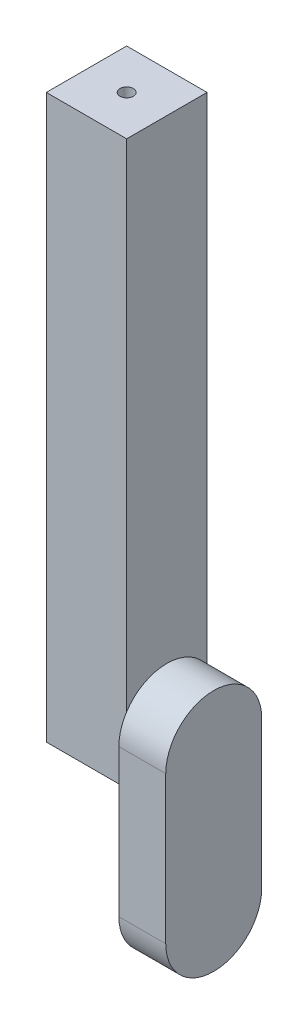
ISO-10303-21;
HEADER;
FILE_DESCRIPTION(('STEP AP214'),'2;1');
FILE_NAME('part.step','',(''),(''),'','','');
FILE_SCHEMA(('AUTOMOTIVE_DESIGN { 1 0 10303 214 1 1 1 1 }'));
ENDSEC;
DATA;
#1=APPLICATION_CONTEXT('core data for automotive mechanical design processes');
#2=APPLICATION_PROTOCOL_DEFINITION('international standard','automotive_design',2000,#1);
#3=PRODUCT_CONTEXT('',#1,'mechanical');
#4=PRODUCT('Part','Part','',(#3));
#5=PRODUCT_RELATED_PRODUCT_CATEGORY('part','',(#4));
#6=PRODUCT_DEFINITION_FORMATION('','',#4);
#7=PRODUCT_DEFINITION_CONTEXT('part definition',#1,'design');
#8=PRODUCT_DEFINITION('design','',#6,#7);
#9=PRODUCT_DEFINITION_SHAPE('','',#8);
#10=(LENGTH_UNIT() NAMED_UNIT(*) SI_UNIT(.MILLI.,.METRE.));
#11=(NAMED_UNIT(*) PLANE_ANGLE_UNIT() SI_UNIT($,.RADIAN.));
#12=(NAMED_UNIT(*) SI_UNIT($,.STERADIAN.) SOLID_ANGLE_UNIT());
#13=UNCERTAINTY_MEASURE_WITH_UNIT(LENGTH_MEASURE(1.E-05),#10,'distance_accuracy_value','');
#14=(GEOMETRIC_REPRESENTATION_CONTEXT(3) GLOBAL_UNCERTAINTY_ASSIGNED_CONTEXT((#13)) GLOBAL_UNIT_ASSIGNED_CONTEXT((#10,
#11,#12)) REPRESENTATION_CONTEXT('',''));
#15=CARTESIAN_POINT('',(0.,0.,0.));
#16=DIRECTION('',(0.,0.,1.));
#17=DIRECTION('',(1.,0.,0.));
#18=AXIS2_PLACEMENT_3D('',#15,#16,#17);
#19=CARTESIAN_POINT('',(0.,0.,0.));
#20=DIRECTION('',(1.,0.,0.));
#21=DIRECTION('',(0.,0.,-1.));
#22=AXIS2_PLACEMENT_3D('',#19,#20,#21);
#23=CYLINDRICAL_SURFACE('',#22,12.5);
#24=CARTESIAN_POINT('',(30.,0.,0.));
#25=DIRECTION('',(1.,0.,0.));
#26=DIRECTION('',(0.,0.,-1.));
#27=AXIS2_PLACEMENT_3D('',#24,#25,#26);
#28=CIRCLE('',#27,12.5);
#29=CARTESIAN_POINT('',(30.,0.,-12.5));
#30=VERTEX_POINT('',#29);
#31=EDGE_CURVE('E48',#30,#30,#28,.T.);
#32=ORIENTED_EDGE('',*,*,#31,.F.);
#33=EDGE_LOOP('',(#32));
#34=FACE_BOUND('',#33,.T.);
#35=CARTESIAN_POINT('',(22.5,0.,0.));
#36=DIRECTION('',(-1.,0.,0.));
#37=DIRECTION('',(0.,0.,1.));
#38=AXIS2_PLACEMENT_3D('',#35,#36,#37);
#39=CIRCLE('',#38,12.5);
#40=CARTESIAN_POINT('',(22.5,0.,12.5));
#41=VERTEX_POINT('',#40);
#42=EDGE_CURVE('E214',#41,#41,#39,.T.);
#43=ORIENTED_EDGE('',*,*,#42,.F.);
#44=EDGE_LOOP('',(#43));
#45=FACE_BOUND('',#44,.T.);
#46=ADVANCED_FACE('F44',(#34,#45),#23,.T.);
#47=CARTESIAN_POINT('',(30.,500.,-30.));
#48=DIRECTION('',(-1.,0.,0.));
#49=DIRECTION('',(0.,0.,1.));
#50=AXIS2_PLACEMENT_3D('',#47,#48,#49);
#51=PLANE('',#50);
#52=CARTESIAN_POINT('',(30.,110.,0.));
#53=DIRECTION('',(1.,0.,0.));
#54=DIRECTION('',(0.,0.,-1.));
#55=AXIS2_PLACEMENT_3D('',#52,#53,#54);
#56=CIRCLE('',#55,35.8197887867249);
#57=CARTESIAN_POINT('',(30.,129.571848883679,-30.));
#58=VERTEX_POINT('',#57);
#59=CARTESIAN_POINT('',(30.,129.571848883679,30.));
#60=VERTEX_POINT('',#59);
#61=EDGE_CURVE('E13',#58,#60,#56,.T.);
#62=ORIENTED_EDGE('',*,*,#61,.F.);
#63=DIRECTION('',(0.,-1.,0.));
#64=VECTOR('',#63,1.);
#65=CARTESIAN_POINT('',(30.,500.,-30.));
#66=LINE('',#65,#64);
#67=CARTESIAN_POINT('',(30.,500.,-30.));
#68=VERTEX_POINT('',#67);
#69=EDGE_CURVE('E177',#68,#58,#66,.T.);
#70=ORIENTED_EDGE('',*,*,#69,.F.);
#71=DIRECTION('',(0.,0.,-1.));
#72=VECTOR('',#71,1.);
#73=CARTESIAN_POINT('',(30.,500.,-30.));
#74=LINE('',#73,#72);
#75=CARTESIAN_POINT('',(30.,500.,30.));
#76=VERTEX_POINT('',#75);
#77=EDGE_CURVE('E192',#76,#68,#74,.T.);
#78=ORIENTED_EDGE('',*,*,#77,.F.);
#79=DIRECTION('',(0.,-1.,0.));
#80=VECTOR('',#79,1.);
#81=CARTESIAN_POINT('',(30.,500.,30.));
#82=LINE('',#81,#80);
#83=EDGE_CURVE('E106',#76,#60,#82,.T.);
#84=ORIENTED_EDGE('',*,*,#83,.T.);
#85=EDGE_LOOP('',(#62,#70,#78,#84));
#86=FACE_BOUND('',#85,.T.);
#87=ADVANCED_FACE('F204',(#86),#51,.F.);
#88=CARTESIAN_POINT('',(-30.,500.,-30.));
#89=DIRECTION('',(0.,0.,1.));
#90=DIRECTION('',(1.,0.,0.));
#91=AXIS2_PLACEMENT_3D('',#88,#89,#90);
#92=PLANE('',#91);
#93=ORIENTED_EDGE('',*,*,#69,.T.);
#94=CARTESIAN_POINT('',(30.,80.,-30.));
#95=VERTEX_POINT('',#94);
#96=EDGE_CURVE('E69',#58,#95,#66,.T.);
#97=ORIENTED_EDGE('',*,*,#96,.T.);
#98=DIRECTION('',(1.,0.,0.));
#99=VECTOR('',#98,1.);
#100=CARTESIAN_POINT('',(-30.,80.,-30.));
#101=LINE('',#100,#99);
#102=CARTESIAN_POINT('',(-30.,80.,-30.));
#103=VERTEX_POINT('',#102);
#104=EDGE_CURVE('E53',#103,#95,#101,.T.);
#105=ORIENTED_EDGE('',*,*,#104,.F.);
#106=DIRECTION('',(0.,-1.,0.));
#107=VECTOR('',#106,1.);
#108=CARTESIAN_POINT('',(-30.,500.,-30.));
#109=LINE('',#108,#107);
#110=CARTESIAN_POINT('',(-30.,500.,-30.));
#111=VERTEX_POINT('',#110);
#112=EDGE_CURVE('E179',#111,#103,#109,.T.);
#113=ORIENTED_EDGE('',*,*,#112,.F.);
#114=DIRECTION('',(-1.,0.,0.));
#115=VECTOR('',#114,1.);
#116=CARTESIAN_POINT('',(-30.,500.,-30.));
#117=LINE('',#116,#115);
#118=EDGE_CURVE('E101',#68,#111,#117,.T.);
#119=ORIENTED_EDGE('',*,*,#118,.F.);
#120=EDGE_LOOP('',(#93,#97,#105,#113,#119));
#121=FACE_BOUND('',#120,.T.);
#122=ADVANCED_FACE('F205',(#121),#92,.F.);
#123=CARTESIAN_POINT('',(-30.,500.,-30.));
#124=DIRECTION('',(1.,0.,0.));
#125=DIRECTION('',(0.,0.,-1.));
#126=AXIS2_PLACEMENT_3D('',#123,#124,#125);
#127=PLANE('',#126);
#128=ORIENTED_EDGE('',*,*,#112,.T.);
#129=DIRECTION('',(0.,0.,1.));
#130=VECTOR('',#129,1.);
#131=CARTESIAN_POINT('',(-30.,80.,30.));
#132=LINE('',#131,#130);
#133=CARTESIAN_POINT('',(-30.,80.,30.));
#134=VERTEX_POINT('',#133);
#135=EDGE_CURVE('E182',#103,#134,#132,.T.);
#136=ORIENTED_EDGE('',*,*,#135,.T.);
#137=DIRECTION('',(0.,-1.,0.));
#138=VECTOR('',#137,1.);
#139=CARTESIAN_POINT('',(-30.,500.,30.));
#140=LINE('',#139,#138);
#141=CARTESIAN_POINT('',(-30.,500.,30.));
#142=VERTEX_POINT('',#141);
#143=EDGE_CURVE('E183',#142,#134,#140,.T.);
#144=ORIENTED_EDGE('',*,*,#143,.F.);
#145=DIRECTION('',(0.,0.,1.));
#146=VECTOR('',#145,1.);
#147=CARTESIAN_POINT('',(-30.,500.,-30.));
#148=LINE('',#147,#146);
#149=EDGE_CURVE('E189',#111,#142,#148,.T.);
#150=ORIENTED_EDGE('',*,*,#149,.F.);
#151=EDGE_LOOP('',(#128,#136,#144,#150));
#152=FACE_BOUND('',#151,.T.);
#153=ADVANCED_FACE('F46',(#152),#127,.F.);
#154=CARTESIAN_POINT('',(-30.,500.,30.));
#155=DIRECTION('',(0.,0.,-1.));
#156=DIRECTION('',(-1.,0.,0.));
#157=AXIS2_PLACEMENT_3D('',#154,#155,#156);
#158=PLANE('',#157);
#159=ORIENTED_EDGE('',*,*,#143,.T.);
#160=DIRECTION('',(1.,0.,0.));
#161=VECTOR('',#160,1.);
#162=CARTESIAN_POINT('',(-30.,80.,30.));
#163=LINE('',#162,#161);
#164=CARTESIAN_POINT('',(30.,80.,30.));
#165=VERTEX_POINT('',#164);
#166=EDGE_CURVE('E82',#134,#165,#163,.T.);
#167=ORIENTED_EDGE('',*,*,#166,.T.);
#168=EDGE_CURVE('E176',#60,#165,#82,.T.);
#169=ORIENTED_EDGE('',*,*,#168,.F.);
#170=ORIENTED_EDGE('',*,*,#83,.F.);
#171=DIRECTION('',(1.,0.,0.));
#172=VECTOR('',#171,1.);
#173=CARTESIAN_POINT('',(-30.,500.,30.));
#174=LINE('',#173,#172);
#175=EDGE_CURVE('E187',#142,#76,#174,.T.);
#176=ORIENTED_EDGE('',*,*,#175,.F.);
#177=EDGE_LOOP('',(#159,#167,#169,#170,#176));
#178=FACE_BOUND('',#177,.T.);
#179=ADVANCED_FACE('F201',(#178),#158,.F.);
#180=CARTESIAN_POINT('',(0.,500.,0.));
#181=DIRECTION('',(0.,1.,0.));
#182=DIRECTION('',(0.,0.,1.));
#183=AXIS2_PLACEMENT_3D('',#180,#181,#182);
#184=PLANE('',#183);
#185=CARTESIAN_POINT('',(0.,500.,0.));
#186=DIRECTION('',(0.,1.,0.));
#187=DIRECTION('',(0.,0.,1.));
#188=AXIS2_PLACEMENT_3D('',#185,#186,#187);
#189=CIRCLE('',#188,5.);
#190=CARTESIAN_POINT('',(0.,500.,5.));
#191=VERTEX_POINT('',#190);
#192=EDGE_CURVE('E223',#191,#191,#189,.T.);
#193=ORIENTED_EDGE('',*,*,#192,.F.);
#194=EDGE_LOOP('',(#193));
#195=FACE_BOUND('',#194,.T.);
#196=ORIENTED_EDGE('',*,*,#77,.T.);
#197=ORIENTED_EDGE('',*,*,#118,.T.);
#198=ORIENTED_EDGE('',*,*,#149,.T.);
#199=ORIENTED_EDGE('',*,*,#175,.T.);
#200=EDGE_LOOP('',(#196,#197,#198,#199));
#201=FACE_BOUND('',#200,.T.);
#202=ADVANCED_FACE('F203',(#195,#201),#184,.T.);
#203=CARTESIAN_POINT('',(-30.,80.,30.));
#204=DIRECTION('',(0.,1.,0.));
#205=DIRECTION('',(0.,0.,1.));
#206=AXIS2_PLACEMENT_3D('',#203,#204,#205);
#207=PLANE('',#206);
#208=DIRECTION('',(0.,0.,1.));
#209=VECTOR('',#208,1.);
#210=CARTESIAN_POINT('',(30.,80.,30.));
#211=LINE('',#210,#209);
#212=EDGE_CURVE('E87',#95,#165,#211,.T.);
#213=ORIENTED_EDGE('',*,*,#212,.T.);
#214=ORIENTED_EDGE('',*,*,#166,.F.);
#215=ORIENTED_EDGE('',*,*,#135,.F.);
#216=ORIENTED_EDGE('',*,*,#104,.T.);
#217=EDGE_LOOP('',(#213,#214,#215,#216));
#218=FACE_BOUND('',#217,.T.);
#219=ADVANCED_FACE('F232',(#218),#207,.F.);
#220=CARTESIAN_POINT('',(30.,110.,0.));
#221=DIRECTION('',(1.,0.,0.));
#222=DIRECTION('',(0.,0.,-1.));
#223=AXIS2_PLACEMENT_3D('',#220,#221,#222);
#224=PLANE('',#223);
#225=ORIENTED_EDGE('',*,*,#31,.T.);
#226=EDGE_LOOP('',(#225));
#227=FACE_BOUND('',#226,.T.);
#228=CARTESIAN_POINT('',(30.,110.,35.8197887867249));
#229=VERTEX_POINT('',#228);
#230=EDGE_CURVE('E56',#60,#229,#56,.T.);
#231=ORIENTED_EDGE('',*,*,#230,.F.);
#232=ORIENTED_EDGE('',*,*,#168,.T.);
#233=ORIENTED_EDGE('',*,*,#212,.F.);
#234=ORIENTED_EDGE('',*,*,#96,.F.);
#235=CARTESIAN_POINT('',(30.,110.,-35.8197887867249));
#236=VERTEX_POINT('',#235);
#237=EDGE_CURVE('E55',#236,#58,#56,.T.);
#238=ORIENTED_EDGE('',*,*,#237,.F.);
#239=DIRECTION('',(0.,1.,0.));
#240=VECTOR('',#239,1.);
#241=CARTESIAN_POINT('',(30.,110.,-35.8197887867249));
#242=LINE('',#241,#240);
#243=CARTESIAN_POINT('',(30.,0.,-35.8197887867249));
#244=VERTEX_POINT('',#243);
#245=EDGE_CURVE('E135',#244,#236,#242,.T.);
#246=ORIENTED_EDGE('',*,*,#245,.F.);
#247=CARTESIAN_POINT('',(30.,0.,0.));
#248=DIRECTION('',(1.,0.,0.));
#249=DIRECTION('',(0.,0.,-1.));
#250=AXIS2_PLACEMENT_3D('',#247,#248,#249);
#251=CIRCLE('',#250,35.8197887867249);
#252=CARTESIAN_POINT('',(30.,0.,35.8197887867249));
#253=VERTEX_POINT('',#252);
#254=EDGE_CURVE('E170',#253,#244,#251,.T.);
#255=ORIENTED_EDGE('',*,*,#254,.F.);
#256=DIRECTION('',(0.,-1.,0.));
#257=VECTOR('',#256,1.);
#258=CARTESIAN_POINT('',(30.,110.,35.8197887867249));
#259=LINE('',#258,#257);
#260=EDGE_CURVE('E156',#229,#253,#259,.T.);
#261=ORIENTED_EDGE('',*,*,#260,.F.);
#262=EDGE_LOOP('',(#231,#232,#233,#234,#238,#246,#255,#261));
#263=FACE_BOUND('',#262,.T.);
#264=ADVANCED_FACE('F209',(#227,#263),#224,.F.);
#265=CARTESIAN_POINT('',(65.,110.,0.));
#266=DIRECTION('',(-1.,0.,0.));
#267=DIRECTION('',(0.,0.,1.));
#268=AXIS2_PLACEMENT_3D('',#265,#266,#267);
#269=CYLINDRICAL_SURFACE('',#268,35.8197887867249);
#270=ORIENTED_EDGE('',*,*,#237,.T.);
#271=ORIENTED_EDGE('',*,*,#61,.T.);
#272=ORIENTED_EDGE('',*,*,#230,.T.);
#273=DIRECTION('',(-1.,0.,0.));
#274=VECTOR('',#273,1.);
#275=CARTESIAN_POINT('',(65.,110.,35.8197887867249));
#276=LINE('',#275,#274);
#277=CARTESIAN_POINT('',(65.,110.,35.8197887867249));
#278=VERTEX_POINT('',#277);
#279=EDGE_CURVE('E159',#278,#229,#276,.T.);
#280=ORIENTED_EDGE('',*,*,#279,.F.);
#281=CARTESIAN_POINT('',(65.,110.,0.));
#282=DIRECTION('',(1.,0.,0.));
#283=DIRECTION('',(0.,0.,-1.));
#284=AXIS2_PLACEMENT_3D('',#281,#282,#283);
#285=CIRCLE('',#284,35.8197887867249);
#286=CARTESIAN_POINT('',(65.,110.,-35.8197887867249));
#287=VERTEX_POINT('',#286);
#288=EDGE_CURVE('E149',#287,#278,#285,.T.);
#289=ORIENTED_EDGE('',*,*,#288,.F.);
#290=DIRECTION('',(-1.,0.,0.));
#291=VECTOR('',#290,1.);
#292=CARTESIAN_POINT('',(65.,110.,-35.8197887867249));
#293=LINE('',#292,#291);
#294=EDGE_CURVE('E164',#287,#236,#293,.T.);
#295=ORIENTED_EDGE('',*,*,#294,.T.);
#296=EDGE_LOOP('',(#270,#271,#272,#280,#289,#295));
#297=FACE_BOUND('',#296,.T.);
#298=ADVANCED_FACE('F211',(#297),#269,.T.);
#299=CARTESIAN_POINT('',(65.,110.,35.8197887867249));
#300=DIRECTION('',(0.,0.,-1.));
#301=DIRECTION('',(-1.,0.,0.));
#302=AXIS2_PLACEMENT_3D('',#299,#300,#301);
#303=PLANE('',#302);
#304=ORIENTED_EDGE('',*,*,#260,.T.);
#305=DIRECTION('',(-1.,0.,0.));
#306=VECTOR('',#305,1.);
#307=CARTESIAN_POINT('',(65.,0.,35.8197887867249));
#308=LINE('',#307,#306);
#309=CARTESIAN_POINT('',(65.,0.,35.8197887867249));
#310=VERTEX_POINT('',#309);
#311=EDGE_CURVE('E153',#310,#253,#308,.T.);
#312=ORIENTED_EDGE('',*,*,#311,.F.);
#313=DIRECTION('',(0.,-1.,0.));
#314=VECTOR('',#313,1.);
#315=CARTESIAN_POINT('',(65.,110.,35.8197887867249));
#316=LINE('',#315,#314);
#317=EDGE_CURVE('E143',#278,#310,#316,.T.);
#318=ORIENTED_EDGE('',*,*,#317,.F.);
#319=ORIENTED_EDGE('',*,*,#279,.T.);
#320=EDGE_LOOP('',(#304,#312,#318,#319));
#321=FACE_BOUND('',#320,.T.);
#322=ADVANCED_FACE('F154',(#321),#303,.F.);
#323=CARTESIAN_POINT('',(65.,0.,0.));
#324=DIRECTION('',(-1.,0.,0.));
#325=DIRECTION('',(0.,0.,1.));
#326=AXIS2_PLACEMENT_3D('',#323,#324,#325);
#327=CYLINDRICAL_SURFACE('',#326,35.8197887867249);
#328=ORIENTED_EDGE('',*,*,#254,.T.);
#329=DIRECTION('',(-1.,0.,0.));
#330=VECTOR('',#329,1.);
#331=CARTESIAN_POINT('',(65.,0.,-35.8197887867249));
#332=LINE('',#331,#330);
#333=CARTESIAN_POINT('',(65.,0.,-35.8197887867249));
#334=VERTEX_POINT('',#333);
#335=EDGE_CURVE('E160',#334,#244,#332,.T.);
#336=ORIENTED_EDGE('',*,*,#335,.F.);
#337=CARTESIAN_POINT('',(65.,0.,0.));
#338=DIRECTION('',(1.,0.,0.));
#339=DIRECTION('',(0.,0.,-1.));
#340=AXIS2_PLACEMENT_3D('',#337,#338,#339);
#341=CIRCLE('',#340,35.8197887867249);
#342=EDGE_CURVE('E146',#310,#334,#341,.T.);
#343=ORIENTED_EDGE('',*,*,#342,.F.);
#344=ORIENTED_EDGE('',*,*,#311,.T.);
#345=EDGE_LOOP('',(#328,#336,#343,#344));
#346=FACE_BOUND('',#345,.T.);
#347=ADVANCED_FACE('F162',(#346),#327,.T.);
#348=CARTESIAN_POINT('',(65.,110.,-35.8197887867249));
#349=DIRECTION('',(0.,0.,1.));
#350=DIRECTION('',(1.,0.,0.));
#351=AXIS2_PLACEMENT_3D('',#348,#349,#350);
#352=PLANE('',#351);
#353=ORIENTED_EDGE('',*,*,#245,.T.);
#354=ORIENTED_EDGE('',*,*,#294,.F.);
#355=DIRECTION('',(0.,1.,0.));
#356=VECTOR('',#355,1.);
#357=CARTESIAN_POINT('',(65.,110.,-35.8197887867249));
#358=LINE('',#357,#356);
#359=EDGE_CURVE('E115',#334,#287,#358,.T.);
#360=ORIENTED_EDGE('',*,*,#359,.F.);
#361=ORIENTED_EDGE('',*,*,#335,.T.);
#362=EDGE_LOOP('',(#353,#354,#360,#361));
#363=FACE_BOUND('',#362,.T.);
#364=ADVANCED_FACE('F212',(#363),#352,.F.);
#365=CARTESIAN_POINT('',(65.,110.,0.));
#366=DIRECTION('',(1.,0.,0.));
#367=DIRECTION('',(0.,0.,-1.));
#368=AXIS2_PLACEMENT_3D('',#365,#366,#367);
#369=PLANE('',#368);
#370=ORIENTED_EDGE('',*,*,#288,.T.);
#371=ORIENTED_EDGE('',*,*,#317,.T.);
#372=ORIENTED_EDGE('',*,*,#342,.T.);
#373=ORIENTED_EDGE('',*,*,#359,.T.);
#374=EDGE_LOOP('',(#370,#371,#372,#373));
#375=FACE_BOUND('',#374,.T.);
#376=ADVANCED_FACE('F144',(#375),#369,.T.);
#377=CARTESIAN_POINT('',(22.5,0.,0.));
#378=DIRECTION('',(-1.,0.,0.));
#379=DIRECTION('',(0.,0.,1.));
#380=AXIS2_PLACEMENT_3D('',#377,#378,#379);
#381=PLANE('',#380);
#382=ORIENTED_EDGE('',*,*,#42,.T.);
#383=EDGE_LOOP('',(#382));
#384=FACE_BOUND('',#383,.T.);
#385=ADVANCED_FACE('F251',(#384),#381,.T.);
#386=CARTESIAN_POINT('',(0.,480.,0.));
#387=DIRECTION('',(0.,1.,0.));
#388=DIRECTION('',(0.,0.,1.));
#389=AXIS2_PLACEMENT_3D('',#386,#387,#388);
#390=CYLINDRICAL_SURFACE('',#389,5.);
#391=CARTESIAN_POINT('',(0.,480.,0.));
#392=DIRECTION('',(0.,1.,0.));
#393=DIRECTION('',(0.,0.,1.));
#394=AXIS2_PLACEMENT_3D('',#391,#392,#393);
#395=CIRCLE('',#394,5.);
#396=CARTESIAN_POINT('',(0.,480.,5.));
#397=VERTEX_POINT('',#396);
#398=EDGE_CURVE('E218',#397,#397,#395,.T.);
#399=ORIENTED_EDGE('',*,*,#398,.F.);
#400=EDGE_LOOP('',(#399));
#401=FACE_BOUND('',#400,.T.);
#402=ORIENTED_EDGE('',*,*,#192,.T.);
#403=EDGE_LOOP('',(#402));
#404=FACE_BOUND('',#403,.T.);
#405=ADVANCED_FACE('F229',(#401,#404),#390,.F.);
#406=CARTESIAN_POINT('',(0.,480.,0.));
#407=DIRECTION('',(0.,1.,0.));
#408=DIRECTION('',(0.,0.,1.));
#409=AXIS2_PLACEMENT_3D('',#406,#407,#408);
#410=PLANE('',#409);
#411=ORIENTED_EDGE('',*,*,#398,.T.);
#412=EDGE_LOOP('',(#411));
#413=FACE_BOUND('',#412,.T.);
#414=ADVANCED_FACE('F317',(#413),#410,.T.);
#415=CLOSED_SHELL('',(#46,#87,#122,#153,#179,#202,#219,#264,#298,#322,#347,#364,#376,#385,#405,#414));
#416=MANIFOLD_SOLID_BREP('B2',#415);
#417=ADVANCED_BREP_SHAPE_REPRESENTATION('',(#18,#416),#14);
#418=SHAPE_DEFINITION_REPRESENTATION(#9,#417);
ENDSEC;
END-ISO-10303-21;
